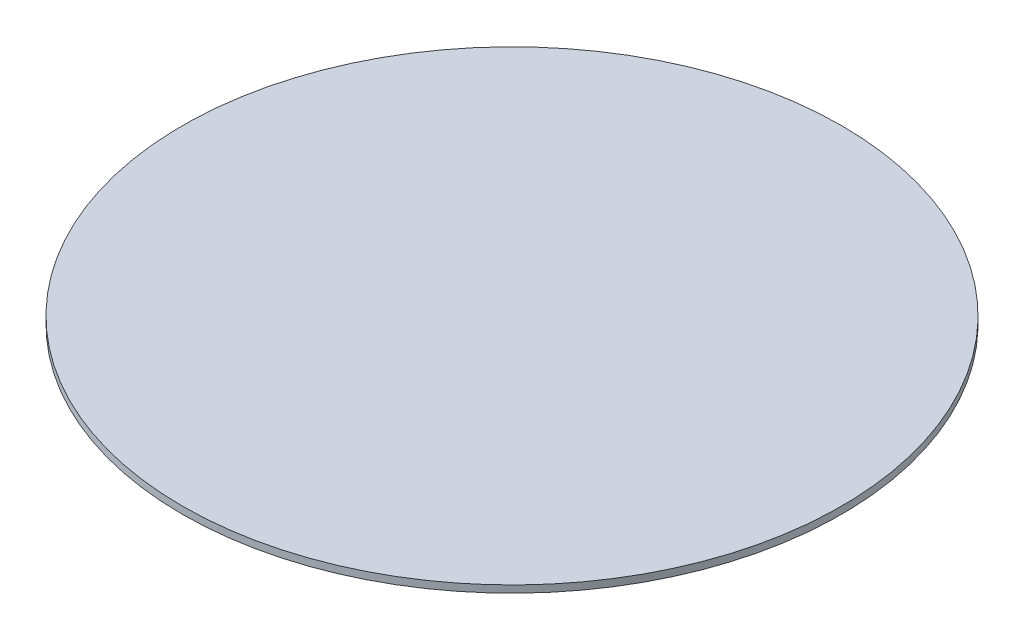
ISO-10303-21;
HEADER;
FILE_DESCRIPTION(('STEP AP214'),'2;1');
FILE_NAME('part.step','',(''),(''),'','','');
FILE_SCHEMA(('AUTOMOTIVE_DESIGN { 1 0 10303 214 1 1 1 1 }'));
ENDSEC;
DATA;
#1=APPLICATION_CONTEXT('core data for automotive mechanical design processes');
#2=APPLICATION_PROTOCOL_DEFINITION('international standard','automotive_design',2000,#1);
#3=PRODUCT_CONTEXT('',#1,'mechanical');
#4=PRODUCT('Part','Part','',(#3));
#5=PRODUCT_RELATED_PRODUCT_CATEGORY('part','',(#4));
#6=PRODUCT_DEFINITION_FORMATION('','',#4);
#7=PRODUCT_DEFINITION_CONTEXT('part definition',#1,'design');
#8=PRODUCT_DEFINITION('design','',#6,#7);
#9=PRODUCT_DEFINITION_SHAPE('','',#8);
#10=(LENGTH_UNIT() NAMED_UNIT(*) SI_UNIT(.MILLI.,.METRE.));
#11=(NAMED_UNIT(*) PLANE_ANGLE_UNIT() SI_UNIT($,.RADIAN.));
#12=(NAMED_UNIT(*) SI_UNIT($,.STERADIAN.) SOLID_ANGLE_UNIT());
#13=UNCERTAINTY_MEASURE_WITH_UNIT(LENGTH_MEASURE(1.E-05),#10,'distance_accuracy_value','');
#14=(GEOMETRIC_REPRESENTATION_CONTEXT(3) GLOBAL_UNCERTAINTY_ASSIGNED_CONTEXT((#13)) GLOBAL_UNIT_ASSIGNED_CONTEXT((#10,
#11,#12)) REPRESENTATION_CONTEXT('',''));
#15=CARTESIAN_POINT('',(0.,0.,0.));
#16=DIRECTION('',(0.,0.,1.));
#17=DIRECTION('',(1.,0.,0.));
#18=AXIS2_PLACEMENT_3D('',#15,#16,#17);
#19=CARTESIAN_POINT('',(0.,3.25,0.));
#20=DIRECTION('',(0.,-1.,0.));
#21=DIRECTION('',(0.,0.,-1.));
#22=AXIS2_PLACEMENT_3D('',#19,#20,#21);
#23=CYLINDRICAL_SURFACE('',#22,150.);
#24=CARTESIAN_POINT('',(0.,3.25,0.));
#25=DIRECTION('',(0.,1.,0.));
#26=DIRECTION('',(0.,0.,1.));
#27=AXIS2_PLACEMENT_3D('',#24,#25,#26);
#28=CIRCLE('',#27,150.);
#29=CARTESIAN_POINT('',(0.,3.25,-150.));
#30=VERTEX_POINT('',#29);
#31=EDGE_CURVE('E10',#30,#30,#28,.T.);
#32=CARTESIAN_POINT('',(0.,0.,0.));
#33=DIRECTION('',(0.,1.,0.));
#34=DIRECTION('',(0.,0.,1.));
#35=AXIS2_PLACEMENT_3D('',#32,#33,#34);
#36=CIRCLE('',#35,150.);
#37=CARTESIAN_POINT('',(0.,0.,-150.));
#38=VERTEX_POINT('',#37);
#39=EDGE_CURVE('E46',#38,#38,#36,.T.);
#40=CARTESIAN_POINT('',(0.,3.25,-150.));
#41=CARTESIAN_POINT('',(0.,3.21614583333333,-150.));
#42=CARTESIAN_POINT('',(0.,3.18229166666667,-150.));
#43=CARTESIAN_POINT('',(0.,3.11458333333333,-150.));
#44=CARTESIAN_POINT('',(0.,3.08072916666667,-150.));
#45=CARTESIAN_POINT('',(0.,3.01302083333333,-150.));
#46=CARTESIAN_POINT('',(0.,2.97916666666667,-150.));
#47=CARTESIAN_POINT('',(0.,2.91145833333333,-150.));
#48=CARTESIAN_POINT('',(0.,2.87760416666667,-150.));
#49=CARTESIAN_POINT('',(0.,2.80989583333333,-150.));
#50=CARTESIAN_POINT('',(0.,2.77604166666667,-150.));
#51=CARTESIAN_POINT('',(0.,2.70833333333333,-150.));
#52=CARTESIAN_POINT('',(0.,2.67447916666667,-150.));
#53=CARTESIAN_POINT('',(0.,2.60677083333333,-150.));
#54=CARTESIAN_POINT('',(0.,2.57291666666667,-150.));
#55=CARTESIAN_POINT('',(0.,2.50520833333333,-150.));
#56=CARTESIAN_POINT('',(0.,2.47135416666667,-150.));
#57=CARTESIAN_POINT('',(0.,2.40364583333333,-150.));
#58=CARTESIAN_POINT('',(0.,2.36979166666667,-150.));
#59=CARTESIAN_POINT('',(0.,2.30208333333333,-150.));
#60=CARTESIAN_POINT('',(0.,2.26822916666667,-150.));
#61=CARTESIAN_POINT('',(0.,2.20052083333333,-150.));
#62=CARTESIAN_POINT('',(0.,2.16666666666667,-150.));
#63=CARTESIAN_POINT('',(0.,2.09895833333333,-150.));
#64=CARTESIAN_POINT('',(0.,2.06510416666667,-150.));
#65=CARTESIAN_POINT('',(0.,1.99739583333333,-150.));
#66=CARTESIAN_POINT('',(0.,1.96354166666667,-150.));
#67=CARTESIAN_POINT('',(0.,1.89583333333333,-150.));
#68=CARTESIAN_POINT('',(0.,1.86197916666667,-150.));
#69=CARTESIAN_POINT('',(0.,1.79427083333333,-150.));
#70=CARTESIAN_POINT('',(0.,1.76041666666667,-150.));
#71=CARTESIAN_POINT('',(0.,1.69270833333333,-150.));
#72=CARTESIAN_POINT('',(0.,1.65885416666667,-150.));
#73=CARTESIAN_POINT('',(0.,1.59114583333333,-150.));
#74=CARTESIAN_POINT('',(0.,1.55729166666667,-150.));
#75=CARTESIAN_POINT('',(0.,1.48958333333333,-150.));
#76=CARTESIAN_POINT('',(0.,1.45572916666667,-150.));
#77=CARTESIAN_POINT('',(0.,1.38802083333333,-150.));
#78=CARTESIAN_POINT('',(0.,1.35416666666667,-150.));
#79=CARTESIAN_POINT('',(0.,1.28645833333333,-150.));
#80=CARTESIAN_POINT('',(0.,1.25260416666667,-150.));
#81=CARTESIAN_POINT('',(0.,1.18489583333333,-150.));
#82=CARTESIAN_POINT('',(0.,1.15104166666667,-150.));
#83=CARTESIAN_POINT('',(0.,1.08333333333333,-150.));
#84=CARTESIAN_POINT('',(0.,1.04947916666667,-150.));
#85=CARTESIAN_POINT('',(0.,0.981770833333333,-150.));
#86=CARTESIAN_POINT('',(0.,0.947916666666667,-150.));
#87=CARTESIAN_POINT('',(0.,0.880208333333333,-150.));
#88=CARTESIAN_POINT('',(0.,0.846354166666667,-150.));
#89=CARTESIAN_POINT('',(0.,0.778645833333333,-150.));
#90=CARTESIAN_POINT('',(0.,0.744791666666667,-150.));
#91=CARTESIAN_POINT('',(0.,0.677083333333333,-150.));
#92=CARTESIAN_POINT('',(0.,0.643229166666667,-150.));
#93=CARTESIAN_POINT('',(0.,0.575520833333333,-150.));
#94=CARTESIAN_POINT('',(0.,0.541666666666667,-150.));
#95=CARTESIAN_POINT('',(0.,0.473958333333333,-150.));
#96=CARTESIAN_POINT('',(0.,0.440104166666667,-150.));
#97=CARTESIAN_POINT('',(0.,0.372395833333333,-150.));
#98=CARTESIAN_POINT('',(0.,0.338541666666667,-150.));
#99=CARTESIAN_POINT('',(0.,0.270833333333333,-150.));
#100=CARTESIAN_POINT('',(0.,0.236979166666667,-150.));
#101=CARTESIAN_POINT('',(0.,0.169270833333333,-150.));
#102=CARTESIAN_POINT('',(0.,0.135416666666667,-150.));
#103=CARTESIAN_POINT('',(0.,0.0677083333333334,-150.));
#104=CARTESIAN_POINT('',(0.,0.0338541666666667,-150.));
#105=CARTESIAN_POINT('',(0.,0.,-150.));
#106=B_SPLINE_CURVE_WITH_KNOTS('',3,(#40,#41,#42,#43,#44,#45,#46,#47,#48,#49,#50,#51,#52,#53,
#54,#55,#56,#57,#58,#59,#60,#61,#62,#63,#64,#65,#66,#67,#68,#69,#70,#71,#72,#73,#74,#75,#76,#77,
#78,#79,#80,#81,#82,#83,#84,#85,#86,#87,#88,#89,#90,#91,#92,#93,#94,#95,#96,#97,#98,#99,#100,
#101,#102,#103,#104,#105),.UNSPECIFIED.,.F.,.F.,(4,2,2,2,2,2,2,2,2,2,2,2,2,2,2,2,2,2,2,2,2,2,2,
2,2,2,2,2,2,2,2,2,4),(0.,0.1015625,0.203125,0.3046875,0.40625,0.5078125,0.609375,0.7109375,
0.8125,0.9140625,1.015625,1.1171875,1.21875,1.3203125,1.421875,1.5234375,1.625,1.7265625,
1.828125,1.9296875,2.03125,2.1328125,2.234375,2.3359375,2.4375,2.5390625,2.640625,2.7421875,
2.84375,2.9453125,3.046875,3.1484375,3.25),.UNSPECIFIED.);
#107=EDGE_CURVE('BSEAM43',#30,#38,#106,.T.);
#108=ORIENTED_EDGE('',*,*,#31,.F.);
#109=ORIENTED_EDGE('',*,*,#39,.T.);
#110=ORIENTED_EDGE('',*,*,#107,.T.);
#111=ORIENTED_EDGE('',*,*,#107,.F.);
#112=EDGE_LOOP('',(#108,#110,#109,#111));
#113=FACE_BOUND('',#112,.T.);
#114=ADVANCED_FACE('F43',(#113),#23,.T.);
#115=CARTESIAN_POINT('',(0.,3.25,0.));
#116=DIRECTION('',(0.,1.,0.));
#117=DIRECTION('',(0.,0.,1.));
#118=AXIS2_PLACEMENT_3D('',#115,#116,#117);
#119=PLANE('',#118);
#120=ORIENTED_EDGE('',*,*,#31,.T.);
#121=EDGE_LOOP('',(#120));
#122=FACE_BOUND('',#121,.T.);
#123=ADVANCED_FACE('F60',(#122),#119,.T.);
#124=CARTESIAN_POINT('',(0.,0.,0.));
#125=DIRECTION('',(0.,1.,0.));
#126=DIRECTION('',(0.,0.,1.));
#127=AXIS2_PLACEMENT_3D('',#124,#125,#126);
#128=PLANE('',#127);
#129=ORIENTED_EDGE('',*,*,#39,.F.);
#130=EDGE_LOOP('',(#129));
#131=FACE_BOUND('',#130,.T.);
#132=ADVANCED_FACE('F58',(#131),#128,.F.);
#133=CLOSED_SHELL('',(#114,#123,#132));
#134=MANIFOLD_SOLID_BREP('B2',#133);
#135=ADVANCED_BREP_SHAPE_REPRESENTATION('',(#18,#134),#14);
#136=SHAPE_DEFINITION_REPRESENTATION(#9,#135);
ENDSEC;
END-ISO-10303-21;
